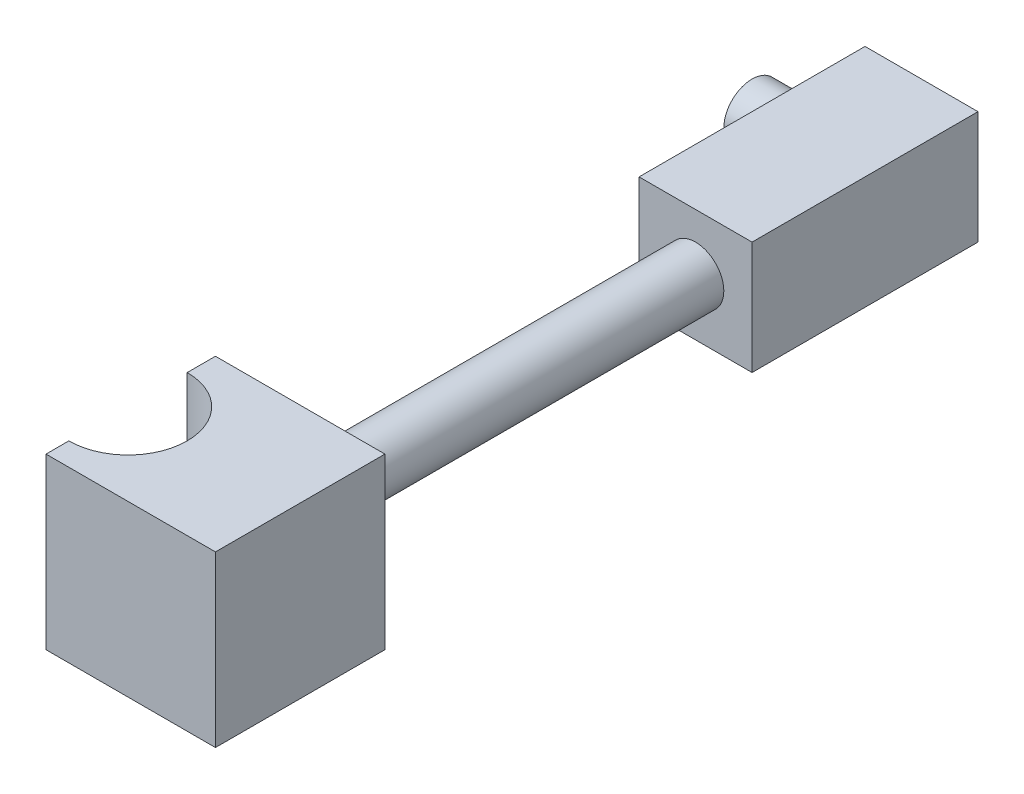
ISO-10303-21;
HEADER;
FILE_DESCRIPTION(('STEP AP214'),'2;1');
FILE_NAME('part.step','',(''),(''),'','','');
FILE_SCHEMA(('AUTOMOTIVE_DESIGN { 1 0 10303 214 1 1 1 1 }'));
ENDSEC;
DATA;
#1=APPLICATION_CONTEXT('core data for automotive mechanical design processes');
#2=APPLICATION_PROTOCOL_DEFINITION('international standard','automotive_design',2000,#1);
#3=PRODUCT_CONTEXT('',#1,'mechanical');
#4=PRODUCT('Part','Part','',(#3));
#5=PRODUCT_RELATED_PRODUCT_CATEGORY('part','',(#4));
#6=PRODUCT_DEFINITION_FORMATION('','',#4);
#7=PRODUCT_DEFINITION_CONTEXT('part definition',#1,'design');
#8=PRODUCT_DEFINITION('design','',#6,#7);
#9=PRODUCT_DEFINITION_SHAPE('','',#8);
#10=(LENGTH_UNIT() NAMED_UNIT(*) SI_UNIT(.MILLI.,.METRE.));
#11=(NAMED_UNIT(*) PLANE_ANGLE_UNIT() SI_UNIT($,.RADIAN.));
#12=(NAMED_UNIT(*) SI_UNIT($,.STERADIAN.) SOLID_ANGLE_UNIT());
#13=UNCERTAINTY_MEASURE_WITH_UNIT(LENGTH_MEASURE(1.E-05),#10,'distance_accuracy_value','');
#14=(GEOMETRIC_REPRESENTATION_CONTEXT(3) GLOBAL_UNCERTAINTY_ASSIGNED_CONTEXT((#13)) GLOBAL_UNIT_ASSIGNED_CONTEXT((#10,
#11,#12)) REPRESENTATION_CONTEXT('',''));
#15=CARTESIAN_POINT('',(0.,0.,0.));
#16=DIRECTION('',(0.,0.,1.));
#17=DIRECTION('',(1.,0.,0.));
#18=AXIS2_PLACEMENT_3D('',#15,#16,#17);
#19=CARTESIAN_POINT('',(-11.4835164835165,25.,118.076923076923));
#20=DIRECTION('',(1.,0.,0.));
#21=DIRECTION('',(0.,1.,0.));
#22=AXIS2_PLACEMENT_3D('',#19,#20,#21);
#23=PLANE('',#22);
#24=DIRECTION('',(0.,1.,0.));
#25=VECTOR('',#24,1.);
#26=CARTESIAN_POINT('',(-11.4835164835165,-5.,93.0769230769231));
#27=LINE('',#26,#25);
#28=CARTESIAN_POINT('',(-11.4835164835165,-5.,93.0769230769231));
#29=VERTEX_POINT('',#28);
#30=CARTESIAN_POINT('',(-11.4835164835165,25.,93.0769230769231));
#31=VERTEX_POINT('',#30);
#32=EDGE_CURVE('E124',#29,#31,#27,.T.);
#33=ORIENTED_EDGE('',*,*,#32,.T.);
#34=DIRECTION('',(0.,0.,-1.));
#35=VECTOR('',#34,1.);
#36=CARTESIAN_POINT('',(-11.4835164835165,25.,118.076923076923));
#37=LINE('',#36,#35);
#38=CARTESIAN_POINT('',(-11.4835164835165,25.,88.0769230769231));
#39=VERTEX_POINT('',#38);
#40=EDGE_CURVE('E355',#31,#39,#37,.T.);
#41=ORIENTED_EDGE('',*,*,#40,.T.);
#42=DIRECTION('',(0.,-1.,0.));
#43=VECTOR('',#42,1.);
#44=CARTESIAN_POINT('',(-11.4835164835165,25.,88.0769230769231));
#45=LINE('',#44,#43);
#46=CARTESIAN_POINT('',(-11.4835164835165,-5.,88.0769230769231));
#47=VERTEX_POINT('',#46);
#48=EDGE_CURVE('E143',#39,#47,#45,.T.);
#49=ORIENTED_EDGE('',*,*,#48,.T.);
#50=DIRECTION('',(0.,0.,-1.));
#51=VECTOR('',#50,1.);
#52=CARTESIAN_POINT('',(-11.4835164835165,-5.,118.076923076923));
#53=LINE('',#52,#51);
#54=EDGE_CURVE('E136',#29,#47,#53,.T.);
#55=ORIENTED_EDGE('',*,*,#54,.F.);
#56=EDGE_LOOP('',(#33,#41,#49,#55));
#57=FACE_BOUND('',#56,.T.);
#58=ADVANCED_FACE('F38',(#57),#23,.F.);
#59=DIRECTION('',(0.,1.,0.));
#60=VECTOR('',#59,1.);
#61=CARTESIAN_POINT('',(-11.4835164835165,-5.,114.035823302132));
#62=LINE('',#61,#60);
#63=CARTESIAN_POINT('',(-11.4835164835165,-5.,114.035823302132));
#64=VERTEX_POINT('',#63);
#65=CARTESIAN_POINT('',(-11.4835164835165,25.,114.035823302132));
#66=VERTEX_POINT('',#65);
#67=EDGE_CURVE('E54',#64,#66,#62,.T.);
#68=ORIENTED_EDGE('',*,*,#67,.F.);
#69=CARTESIAN_POINT('',(-11.4835164835165,-5.,118.076923076923));
#70=VERTEX_POINT('',#69);
#71=EDGE_CURVE('E139',#70,#64,#53,.T.);
#72=ORIENTED_EDGE('',*,*,#71,.F.);
#73=DIRECTION('',(0.,-1.,0.));
#74=VECTOR('',#73,1.);
#75=CARTESIAN_POINT('',(-11.4835164835165,25.,118.076923076923));
#76=LINE('',#75,#74);
#77=CARTESIAN_POINT('',(-11.4835164835165,25.,118.076923076923));
#78=VERTEX_POINT('',#77);
#79=EDGE_CURVE('E358',#78,#70,#76,.T.);
#80=ORIENTED_EDGE('',*,*,#79,.F.);
#81=EDGE_CURVE('E352',#78,#66,#37,.T.);
#82=ORIENTED_EDGE('',*,*,#81,.T.);
#83=EDGE_LOOP('',(#68,#72,#80,#82));
#84=FACE_BOUND('',#83,.T.);
#85=ADVANCED_FACE('F209',(#84),#23,.F.);
#86=CARTESIAN_POINT('',(-11.4835164835165,-5.,118.076923076923));
#87=DIRECTION('',(0.,1.,0.));
#88=DIRECTION('',(-1.,0.,0.));
#89=AXIS2_PLACEMENT_3D('',#86,#87,#88);
#90=PLANE('',#89);
#91=CARTESIAN_POINT('',(-11.4835164835165,-5.,103.556373189527));
#92=DIRECTION('',(0.,1.,0.));
#93=DIRECTION('',(0.,0.,1.));
#94=AXIS2_PLACEMENT_3D('',#91,#92,#93);
#95=CIRCLE('',#94,10.4794501126042);
#96=EDGE_CURVE('E127',#29,#64,#95,.F.);
#97=ORIENTED_EDGE('',*,*,#96,.F.);
#98=ORIENTED_EDGE('',*,*,#54,.T.);
#99=DIRECTION('',(1.,0.,0.));
#100=VECTOR('',#99,1.);
#101=CARTESIAN_POINT('',(-11.4835164835165,-5.,88.0769230769231));
#102=LINE('',#101,#100);
#103=CARTESIAN_POINT('',(18.5164835164835,-5.,88.0769230769231));
#104=VERTEX_POINT('',#103);
#105=EDGE_CURVE('E367',#47,#104,#102,.T.);
#106=ORIENTED_EDGE('',*,*,#105,.T.);
#107=DIRECTION('',(0.,0.,-1.));
#108=VECTOR('',#107,1.);
#109=CARTESIAN_POINT('',(18.5164835164835,-5.,118.076923076923));
#110=LINE('',#109,#108);
#111=CARTESIAN_POINT('',(18.5164835164835,-5.,118.076923076923));
#112=VERTEX_POINT('',#111);
#113=EDGE_CURVE('E144',#112,#104,#110,.T.);
#114=ORIENTED_EDGE('',*,*,#113,.F.);
#115=DIRECTION('',(1.,0.,0.));
#116=VECTOR('',#115,1.);
#117=CARTESIAN_POINT('',(-11.4835164835165,-5.,118.076923076923));
#118=LINE('',#117,#116);
#119=EDGE_CURVE('E373',#70,#112,#118,.T.);
#120=ORIENTED_EDGE('',*,*,#119,.F.);
#121=ORIENTED_EDGE('',*,*,#71,.T.);
#122=EDGE_LOOP('',(#97,#98,#106,#114,#120,#121));
#123=FACE_BOUND('',#122,.T.);
#124=ADVANCED_FACE('F135',(#123),#90,.F.);
#125=CARTESIAN_POINT('',(-11.4835164835165,25.,118.076923076923));
#126=DIRECTION('',(0.,-1.,0.));
#127=DIRECTION('',(0.,0.,-1.));
#128=AXIS2_PLACEMENT_3D('',#125,#126,#127);
#129=PLANE('',#128);
#130=CARTESIAN_POINT('',(-11.4835164835165,25.,103.556373189527));
#131=DIRECTION('',(0.,1.,0.));
#132=DIRECTION('',(0.,0.,1.));
#133=AXIS2_PLACEMENT_3D('',#130,#131,#132);
#134=CIRCLE('',#133,10.4794501126042);
#135=EDGE_CURVE('E128',#31,#66,#134,.F.);
#136=ORIENTED_EDGE('',*,*,#135,.T.);
#137=ORIENTED_EDGE('',*,*,#81,.F.);
#138=DIRECTION('',(-1.,0.,0.));
#139=VECTOR('',#138,1.);
#140=CARTESIAN_POINT('',(-11.4835164835165,25.,118.076923076923));
#141=LINE('',#140,#139);
#142=CARTESIAN_POINT('',(18.5164835164835,25.,118.076923076923));
#143=VERTEX_POINT('',#142);
#144=EDGE_CURVE('E361',#143,#78,#141,.T.);
#145=ORIENTED_EDGE('',*,*,#144,.F.);
#146=DIRECTION('',(0.,0.,-1.));
#147=VECTOR('',#146,1.);
#148=CARTESIAN_POINT('',(18.5164835164835,25.,118.076923076923));
#149=LINE('',#148,#147);
#150=CARTESIAN_POINT('',(18.5164835164835,25.,88.0769230769231));
#151=VERTEX_POINT('',#150);
#152=EDGE_CURVE('E148',#143,#151,#149,.T.);
#153=ORIENTED_EDGE('',*,*,#152,.T.);
#154=DIRECTION('',(-1.,0.,0.));
#155=VECTOR('',#154,1.);
#156=CARTESIAN_POINT('',(-11.4835164835165,25.,88.0769230769231));
#157=LINE('',#156,#155);
#158=EDGE_CURVE('E363',#151,#39,#157,.T.);
#159=ORIENTED_EDGE('',*,*,#158,.T.);
#160=ORIENTED_EDGE('',*,*,#40,.F.);
#161=EDGE_LOOP('',(#136,#137,#145,#153,#159,#160));
#162=FACE_BOUND('',#161,.T.);
#163=ADVANCED_FACE('F187',(#162),#129,.F.);
#164=CARTESIAN_POINT('',(-6.4835164835165,20.,-21.9230769230769));
#165=DIRECTION('',(1.,0.,0.));
#166=DIRECTION('',(0.,0.,-1.));
#167=AXIS2_PLACEMENT_3D('',#164,#165,#166);
#168=PLANE('',#167);
#169=CARTESIAN_POINT('',(-6.4835164835165,10.,-11.9230769230769));
#170=DIRECTION('',(1.,0.,0.));
#171=DIRECTION('',(0.,0.,-1.));
#172=AXIS2_PLACEMENT_3D('',#169,#170,#171);
#173=CIRCLE('',#172,5.);
#174=CARTESIAN_POINT('',(-6.4835164835165,10.,-16.9230769230769));
#175=VERTEX_POINT('',#174);
#176=EDGE_CURVE('E42',#175,#175,#173,.F.);
#177=ORIENTED_EDGE('',*,*,#176,.F.);
#178=EDGE_LOOP('',(#177));
#179=FACE_BOUND('',#178,.T.);
#180=DIRECTION('',(0.,0.,1.));
#181=VECTOR('',#180,1.);
#182=CARTESIAN_POINT('',(-6.4835164835165,0.,-21.9230769230769));
#183=LINE('',#182,#181);
#184=CARTESIAN_POINT('',(-6.4835164835165,0.,-21.9230769230769));
#185=VERTEX_POINT('',#184);
#186=CARTESIAN_POINT('',(-6.4835164835165,0.,18.0769230769231));
#187=VERTEX_POINT('',#186);
#188=EDGE_CURVE('E157',#185,#187,#183,.T.);
#189=ORIENTED_EDGE('',*,*,#188,.T.);
#190=DIRECTION('',(0.,-1.,0.));
#191=VECTOR('',#190,1.);
#192=CARTESIAN_POINT('',(-6.4835164835165,20.,18.0769230769231));
#193=LINE('',#192,#191);
#194=CARTESIAN_POINT('',(-6.4835164835165,20.,18.0769230769231));
#195=VERTEX_POINT('',#194);
#196=EDGE_CURVE('E177',#195,#187,#193,.T.);
#197=ORIENTED_EDGE('',*,*,#196,.F.);
#198=DIRECTION('',(0.,0.,1.));
#199=VECTOR('',#198,1.);
#200=CARTESIAN_POINT('',(-6.4835164835165,20.,-21.9230769230769));
#201=LINE('',#200,#199);
#202=CARTESIAN_POINT('',(-6.4835164835165,20.,-21.9230769230769));
#203=VERTEX_POINT('',#202);
#204=EDGE_CURVE('E158',#203,#195,#201,.T.);
#205=ORIENTED_EDGE('',*,*,#204,.F.);
#206=DIRECTION('',(0.,-1.,0.));
#207=VECTOR('',#206,1.);
#208=CARTESIAN_POINT('',(-6.4835164835165,20.,-21.9230769230769));
#209=LINE('',#208,#207);
#210=EDGE_CURVE('E164',#203,#185,#209,.T.);
#211=ORIENTED_EDGE('',*,*,#210,.T.);
#212=EDGE_LOOP('',(#189,#197,#205,#211));
#213=FACE_BOUND('',#212,.T.);
#214=ADVANCED_FACE('F40',(#179,#213),#168,.F.);
#215=CARTESIAN_POINT('',(-6.4835164835165,20.,18.0769230769231));
#216=DIRECTION('',(0.,0.,-1.));
#217=DIRECTION('',(-1.,0.,0.));
#218=AXIS2_PLACEMENT_3D('',#215,#216,#217);
#219=PLANE('',#218);
#220=CARTESIAN_POINT('',(3.5164835164835,10.,18.0769230769231));
#221=DIRECTION('',(0.,0.,1.));
#222=DIRECTION('',(1.,0.,0.));
#223=AXIS2_PLACEMENT_3D('',#220,#221,#222);
#224=CIRCLE('',#223,5.);
#225=CARTESIAN_POINT('',(8.51648351648351,10.,18.0769230769231));
#226=VERTEX_POINT('',#225);
#227=EDGE_CURVE('E11',#226,#226,#224,.T.);
#228=ORIENTED_EDGE('',*,*,#227,.F.);
#229=EDGE_LOOP('',(#228));
#230=FACE_BOUND('',#229,.T.);
#231=DIRECTION('',(1.,0.,0.));
#232=VECTOR('',#231,1.);
#233=CARTESIAN_POINT('',(-6.4835164835165,0.,18.0769230769231));
#234=LINE('',#233,#232);
#235=CARTESIAN_POINT('',(13.5164835164835,0.,18.0769230769231));
#236=VERTEX_POINT('',#235);
#237=EDGE_CURVE('E167',#187,#236,#234,.T.);
#238=ORIENTED_EDGE('',*,*,#237,.T.);
#239=DIRECTION('',(0.,-1.,0.));
#240=VECTOR('',#239,1.);
#241=CARTESIAN_POINT('',(13.5164835164835,20.,18.0769230769231));
#242=LINE('',#241,#240);
#243=CARTESIAN_POINT('',(13.5164835164835,20.,18.0769230769231));
#244=VERTEX_POINT('',#243);
#245=EDGE_CURVE('E175',#244,#236,#242,.T.);
#246=ORIENTED_EDGE('',*,*,#245,.F.);
#247=DIRECTION('',(1.,0.,0.));
#248=VECTOR('',#247,1.);
#249=CARTESIAN_POINT('',(-6.4835164835165,20.,18.0769230769231));
#250=LINE('',#249,#248);
#251=EDGE_CURVE('E92',#195,#244,#250,.T.);
#252=ORIENTED_EDGE('',*,*,#251,.F.);
#253=ORIENTED_EDGE('',*,*,#196,.T.);
#254=EDGE_LOOP('',(#238,#246,#252,#253));
#255=FACE_BOUND('',#254,.T.);
#256=ADVANCED_FACE('F186',(#230,#255),#219,.F.);
#257=CARTESIAN_POINT('',(13.5164835164835,20.,-21.9230769230769));
#258=DIRECTION('',(-1.,0.,0.));
#259=DIRECTION('',(0.,0.,1.));
#260=AXIS2_PLACEMENT_3D('',#257,#258,#259);
#261=PLANE('',#260);
#262=DIRECTION('',(0.,0.,-1.));
#263=VECTOR('',#262,1.);
#264=CARTESIAN_POINT('',(13.5164835164835,0.,-21.9230769230769));
#265=LINE('',#264,#263);
#266=CARTESIAN_POINT('',(13.5164835164835,0.,-21.9230769230769));
#267=VERTEX_POINT('',#266);
#268=EDGE_CURVE('E169',#236,#267,#265,.T.);
#269=ORIENTED_EDGE('',*,*,#268,.T.);
#270=DIRECTION('',(0.,-1.,0.));
#271=VECTOR('',#270,1.);
#272=CARTESIAN_POINT('',(13.5164835164835,20.,-21.9230769230769));
#273=LINE('',#272,#271);
#274=CARTESIAN_POINT('',(13.5164835164835,20.,-21.9230769230769));
#275=VERTEX_POINT('',#274);
#276=EDGE_CURVE('E173',#275,#267,#273,.T.);
#277=ORIENTED_EDGE('',*,*,#276,.F.);
#278=DIRECTION('',(0.,0.,-1.));
#279=VECTOR('',#278,1.);
#280=CARTESIAN_POINT('',(13.5164835164835,20.,-21.9230769230769));
#281=LINE('',#280,#279);
#282=EDGE_CURVE('E161',#244,#275,#281,.T.);
#283=ORIENTED_EDGE('',*,*,#282,.F.);
#284=ORIENTED_EDGE('',*,*,#245,.T.);
#285=EDGE_LOOP('',(#269,#277,#283,#284));
#286=FACE_BOUND('',#285,.T.);
#287=ADVANCED_FACE('F195',(#286),#261,.F.);
#288=CARTESIAN_POINT('',(-6.4835164835165,20.,-21.9230769230769));
#289=DIRECTION('',(0.,0.,1.));
#290=DIRECTION('',(1.,0.,0.));
#291=AXIS2_PLACEMENT_3D('',#288,#289,#290);
#292=PLANE('',#291);
#293=DIRECTION('',(-1.,0.,0.));
#294=VECTOR('',#293,1.);
#295=CARTESIAN_POINT('',(-6.4835164835165,0.,-21.9230769230769));
#296=LINE('',#295,#294);
#297=EDGE_CURVE('E84',#267,#185,#296,.T.);
#298=ORIENTED_EDGE('',*,*,#297,.T.);
#299=ORIENTED_EDGE('',*,*,#210,.F.);
#300=DIRECTION('',(-1.,0.,0.));
#301=VECTOR('',#300,1.);
#302=CARTESIAN_POINT('',(-6.4835164835165,20.,-21.9230769230769));
#303=LINE('',#302,#301);
#304=EDGE_CURVE('E63',#275,#203,#303,.T.);
#305=ORIENTED_EDGE('',*,*,#304,.F.);
#306=ORIENTED_EDGE('',*,*,#276,.T.);
#307=EDGE_LOOP('',(#298,#299,#305,#306));
#308=FACE_BOUND('',#307,.T.);
#309=ADVANCED_FACE('F199',(#308),#292,.F.);
#310=CARTESIAN_POINT('',(0.,20.,0.));
#311=DIRECTION('',(0.,1.,0.));
#312=DIRECTION('',(0.,0.,1.));
#313=AXIS2_PLACEMENT_3D('',#310,#311,#312);
#314=PLANE('',#313);
#315=ORIENTED_EDGE('',*,*,#204,.T.);
#316=ORIENTED_EDGE('',*,*,#251,.T.);
#317=ORIENTED_EDGE('',*,*,#282,.T.);
#318=ORIENTED_EDGE('',*,*,#304,.T.);
#319=EDGE_LOOP('',(#315,#316,#317,#318));
#320=FACE_BOUND('',#319,.T.);
#321=ADVANCED_FACE('F197',(#320),#314,.T.);
#322=CARTESIAN_POINT('',(0.,0.,0.));
#323=DIRECTION('',(0.,1.,0.));
#324=DIRECTION('',(0.,0.,1.));
#325=AXIS2_PLACEMENT_3D('',#322,#323,#324);
#326=PLANE('',#325);
#327=ORIENTED_EDGE('',*,*,#188,.F.);
#328=ORIENTED_EDGE('',*,*,#297,.F.);
#329=ORIENTED_EDGE('',*,*,#268,.F.);
#330=ORIENTED_EDGE('',*,*,#237,.F.);
#331=EDGE_LOOP('',(#327,#328,#329,#330));
#332=FACE_BOUND('',#331,.T.);
#333=ADVANCED_FACE('F191',(#332),#326,.F.);
#334=CARTESIAN_POINT('',(-16.4835164835165,10.,-11.9230769230769));
#335=DIRECTION('',(1.,0.,0.));
#336=DIRECTION('',(0.,0.,-1.));
#337=AXIS2_PLACEMENT_3D('',#334,#335,#336);
#338=CYLINDRICAL_SURFACE('',#337,5.);
#339=CARTESIAN_POINT('',(-16.4835164835165,10.,-11.9230769230769));
#340=DIRECTION('',(-1.,0.,0.));
#341=DIRECTION('',(0.,0.,1.));
#342=AXIS2_PLACEMENT_3D('',#339,#340,#341);
#343=CIRCLE('',#342,5.);
#344=CARTESIAN_POINT('',(-16.4835164835165,10.,-6.92307692307693));
#345=VERTEX_POINT('',#344);
#346=EDGE_CURVE('E153',#345,#345,#343,.T.);
#347=ORIENTED_EDGE('',*,*,#346,.F.);
#348=EDGE_LOOP('',(#347));
#349=FACE_BOUND('',#348,.T.);
#350=ORIENTED_EDGE('',*,*,#176,.T.);
#351=EDGE_LOOP('',(#350));
#352=FACE_BOUND('',#351,.T.);
#353=ADVANCED_FACE('F182',(#349,#352),#338,.T.);
#354=CARTESIAN_POINT('',(-16.4835164835165,10.,-11.9230769230769));
#355=DIRECTION('',(-1.,0.,0.));
#356=DIRECTION('',(0.,0.,1.));
#357=AXIS2_PLACEMENT_3D('',#354,#355,#356);
#358=PLANE('',#357);
#359=ORIENTED_EDGE('',*,*,#346,.T.);
#360=EDGE_LOOP('',(#359));
#361=FACE_BOUND('',#360,.T.);
#362=ADVANCED_FACE('F222',(#361),#358,.T.);
#363=CARTESIAN_POINT('',(3.5164835164835,10.,88.0769230769231));
#364=DIRECTION('',(0.,0.,-1.));
#365=DIRECTION('',(-1.,0.,0.));
#366=AXIS2_PLACEMENT_3D('',#363,#364,#365);
#367=CYLINDRICAL_SURFACE('',#366,5.);
#368=CARTESIAN_POINT('',(3.5164835164835,10.,88.0769230769231));
#369=DIRECTION('',(0.,0.,1.));
#370=DIRECTION('',(1.,0.,0.));
#371=AXIS2_PLACEMENT_3D('',#368,#369,#370);
#372=CIRCLE('',#371,5.);
#373=CARTESIAN_POINT('',(8.51648351648351,10.,88.0769230769231));
#374=VERTEX_POINT('',#373);
#375=EDGE_CURVE('E146',#374,#374,#372,.T.);
#376=ORIENTED_EDGE('',*,*,#375,.F.);
#377=EDGE_LOOP('',(#376));
#378=FACE_BOUND('',#377,.T.);
#379=ORIENTED_EDGE('',*,*,#227,.T.);
#380=EDGE_LOOP('',(#379));
#381=FACE_BOUND('',#380,.T.);
#382=ADVANCED_FACE('F218',(#378,#381),#367,.T.);
#383=CARTESIAN_POINT('',(18.5164835164835,25.,118.076923076923));
#384=DIRECTION('',(-1.,0.,0.));
#385=DIRECTION('',(0.,-1.,0.));
#386=AXIS2_PLACEMENT_3D('',#383,#384,#385);
#387=PLANE('',#386);
#388=DIRECTION('',(0.,1.,0.));
#389=VECTOR('',#388,1.);
#390=CARTESIAN_POINT('',(18.5164835164835,25.,88.0769230769231));
#391=LINE('',#390,#389);
#392=EDGE_CURVE('E365',#104,#151,#391,.T.);
#393=ORIENTED_EDGE('',*,*,#392,.T.);
#394=ORIENTED_EDGE('',*,*,#152,.F.);
#395=DIRECTION('',(0.,1.,0.));
#396=VECTOR('',#395,1.);
#397=CARTESIAN_POINT('',(18.5164835164835,25.,118.076923076923));
#398=LINE('',#397,#396);
#399=EDGE_CURVE('E371',#112,#143,#398,.T.);
#400=ORIENTED_EDGE('',*,*,#399,.F.);
#401=ORIENTED_EDGE('',*,*,#113,.T.);
#402=EDGE_LOOP('',(#393,#394,#400,#401));
#403=FACE_BOUND('',#402,.T.);
#404=ADVANCED_FACE('F221',(#403),#387,.F.);
#405=CARTESIAN_POINT('',(0.,0.,118.076923076923));
#406=DIRECTION('',(0.,0.,1.));
#407=DIRECTION('',(1.,0.,0.));
#408=AXIS2_PLACEMENT_3D('',#405,#406,#407);
#409=PLANE('',#408);
#410=ORIENTED_EDGE('',*,*,#79,.T.);
#411=ORIENTED_EDGE('',*,*,#119,.T.);
#412=ORIENTED_EDGE('',*,*,#399,.T.);
#413=ORIENTED_EDGE('',*,*,#144,.T.);
#414=EDGE_LOOP('',(#410,#411,#412,#413));
#415=FACE_BOUND('',#414,.T.);
#416=ADVANCED_FACE('F249',(#415),#409,.T.);
#417=CARTESIAN_POINT('',(0.,0.,88.0769230769231));
#418=DIRECTION('',(0.,0.,1.));
#419=DIRECTION('',(1.,0.,0.));
#420=AXIS2_PLACEMENT_3D('',#417,#418,#419);
#421=PLANE('',#420);
#422=ORIENTED_EDGE('',*,*,#375,.T.);
#423=EDGE_LOOP('',(#422));
#424=FACE_BOUND('',#423,.T.);
#425=ORIENTED_EDGE('',*,*,#48,.F.);
#426=ORIENTED_EDGE('',*,*,#158,.F.);
#427=ORIENTED_EDGE('',*,*,#392,.F.);
#428=ORIENTED_EDGE('',*,*,#105,.F.);
#429=EDGE_LOOP('',(#425,#426,#427,#428));
#430=FACE_BOUND('',#429,.T.);
#431=ADVANCED_FACE('F256',(#424,#430),#421,.F.);
#432=CARTESIAN_POINT('',(-11.4835164835165,-5.,103.556373189527));
#433=DIRECTION('',(0.,1.,0.));
#434=DIRECTION('',(0.,0.,1.));
#435=AXIS2_PLACEMENT_3D('',#432,#433,#434);
#436=CYLINDRICAL_SURFACE('',#435,10.4794501126042);
#437=ORIENTED_EDGE('',*,*,#135,.F.);
#438=ORIENTED_EDGE('',*,*,#32,.F.);
#439=ORIENTED_EDGE('',*,*,#96,.T.);
#440=ORIENTED_EDGE('',*,*,#67,.T.);
#441=EDGE_LOOP('',(#437,#438,#439,#440));
#442=FACE_BOUND('',#441,.T.);
#443=ADVANCED_FACE('F126',(#442),#436,.F.);
#444=CLOSED_SHELL('',(#58,#85,#124,#163,#214,#256,#287,#309,#321,#333,#353,#362,#382,#404,#416,
#431,#443));
#445=MANIFOLD_SOLID_BREP('B2',#444);
#446=ADVANCED_BREP_SHAPE_REPRESENTATION('',(#18,#445),#14);
#447=SHAPE_DEFINITION_REPRESENTATION(#9,#446);
ENDSEC;
END-ISO-10303-21;
